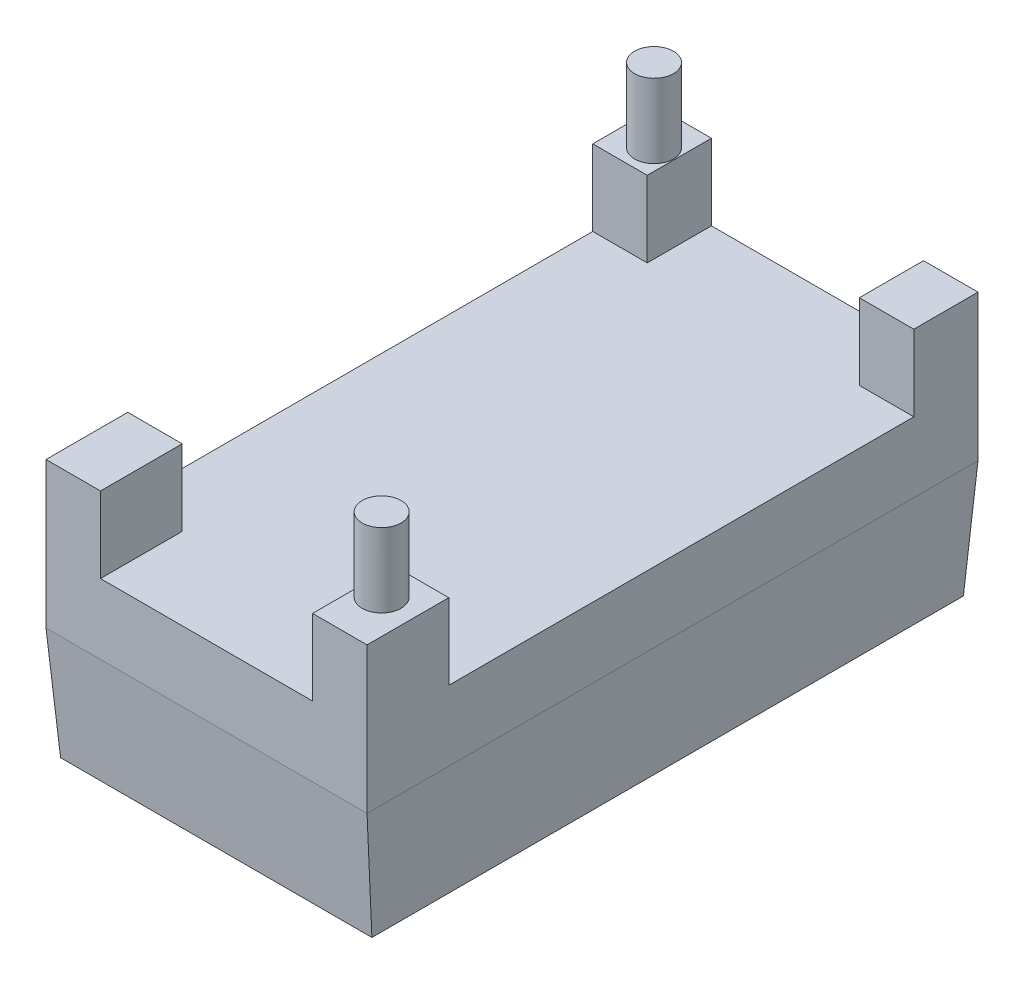
ISO-10303-21;
HEADER;
FILE_DESCRIPTION(('STEP AP214'),'2;1');
FILE_NAME('part.step','',(''),(''),'','','');
FILE_SCHEMA(('AUTOMOTIVE_DESIGN { 1 0 10303 214 1 1 1 1 }'));
ENDSEC;
DATA;
#1=APPLICATION_CONTEXT('core data for automotive mechanical design processes');
#2=APPLICATION_PROTOCOL_DEFINITION('international standard','automotive_design',2000,#1);
#3=PRODUCT_CONTEXT('',#1,'mechanical');
#4=PRODUCT('Part','Part','',(#3));
#5=PRODUCT_RELATED_PRODUCT_CATEGORY('part','',(#4));
#6=PRODUCT_DEFINITION_FORMATION('','',#4);
#7=PRODUCT_DEFINITION_CONTEXT('part definition',#1,'design');
#8=PRODUCT_DEFINITION('design','',#6,#7);
#9=PRODUCT_DEFINITION_SHAPE('','',#8);
#10=(LENGTH_UNIT() NAMED_UNIT(*) SI_UNIT(.MILLI.,.METRE.));
#11=(NAMED_UNIT(*) PLANE_ANGLE_UNIT() SI_UNIT($,.RADIAN.));
#12=(NAMED_UNIT(*) SI_UNIT($,.STERADIAN.) SOLID_ANGLE_UNIT());
#13=UNCERTAINTY_MEASURE_WITH_UNIT(LENGTH_MEASURE(1.E-05),#10,'distance_accuracy_value','');
#14=(GEOMETRIC_REPRESENTATION_CONTEXT(3) GLOBAL_UNCERTAINTY_ASSIGNED_CONTEXT((#13)) GLOBAL_UNIT_ASSIGNED_CONTEXT((#10,
#11,#12)) REPRESENTATION_CONTEXT('',''));
#15=CARTESIAN_POINT('',(0.,0.,0.));
#16=DIRECTION('',(0.,0.,1.));
#17=DIRECTION('',(1.,0.,0.));
#18=AXIS2_PLACEMENT_3D('',#15,#16,#17);
#19=CARTESIAN_POINT('',(8.25,-0.5,15.7));
#20=DIRECTION('',(0.,0.,-1.));
#21=DIRECTION('',(-1.,0.,0.));
#22=AXIS2_PLACEMENT_3D('',#19,#20,#21);
#23=PLANE('',#22);
#24=DIRECTION('',(-1.,0.,0.));
#25=VECTOR('',#24,1.);
#26=CARTESIAN_POINT('',(8.25,2.94999999999996,15.7));
#27=LINE('',#26,#25);
#28=CARTESIAN_POINT('',(8.25,2.94999999999996,15.7));
#29=VERTEX_POINT('',#28);
#30=CARTESIAN_POINT('',(0.,2.94999999999996,15.7));
#31=VERTEX_POINT('',#30);
#32=EDGE_CURVE('E217',#29,#31,#27,.T.);
#33=ORIENTED_EDGE('',*,*,#32,.F.);
#34=DIRECTION('',(0.,1.,0.));
#35=VECTOR('',#34,1.);
#36=CARTESIAN_POINT('',(8.25,-0.5,15.7));
#37=LINE('',#36,#35);
#38=CARTESIAN_POINT('',(8.25,6.7,15.7));
#39=VERTEX_POINT('',#38);
#40=EDGE_CURVE('E61',#29,#39,#37,.T.);
#41=ORIENTED_EDGE('',*,*,#40,.T.);
#42=DIRECTION('',(1.,0.,0.));
#43=VECTOR('',#42,1.);
#44=CARTESIAN_POINT('',(0.,6.7,15.7));
#45=LINE('',#44,#43);
#46=CARTESIAN_POINT('',(6.85,6.7,15.7));
#47=VERTEX_POINT('',#46);
#48=EDGE_CURVE('E57',#47,#39,#45,.T.);
#49=ORIENTED_EDGE('',*,*,#48,.F.);
#50=DIRECTION('',(0.,1.,0.));
#51=VECTOR('',#50,1.);
#52=CARTESIAN_POINT('',(6.85,6.7,15.7));
#53=LINE('',#52,#51);
#54=CARTESIAN_POINT('',(6.85,4.75,15.7));
#55=VERTEX_POINT('',#54);
#56=EDGE_CURVE('E302',#55,#47,#53,.T.);
#57=ORIENTED_EDGE('',*,*,#56,.F.);
#58=DIRECTION('',(-1.,0.,0.));
#59=VECTOR('',#58,1.);
#60=CARTESIAN_POINT('',(0.,4.75,15.7));
#61=LINE('',#60,#59);
#62=CARTESIAN_POINT('',(1.4,4.75,15.7));
#63=VERTEX_POINT('',#62);
#64=EDGE_CURVE('E906',#55,#63,#61,.T.);
#65=ORIENTED_EDGE('',*,*,#64,.T.);
#66=DIRECTION('',(0.,-1.,0.));
#67=VECTOR('',#66,1.);
#68=CARTESIAN_POINT('',(1.4,6.7,15.7));
#69=LINE('',#68,#67);
#70=CARTESIAN_POINT('',(1.4,6.7,15.7));
#71=VERTEX_POINT('',#70);
#72=EDGE_CURVE('E909',#71,#63,#69,.T.);
#73=ORIENTED_EDGE('',*,*,#72,.F.);
#74=DIRECTION('',(1.,0.,0.));
#75=VECTOR('',#74,1.);
#76=CARTESIAN_POINT('',(0.,6.7,15.7));
#77=LINE('',#76,#75);
#78=CARTESIAN_POINT('',(0.,6.7,15.7));
#79=VERTEX_POINT('',#78);
#80=EDGE_CURVE('E907',#79,#71,#77,.T.);
#81=ORIENTED_EDGE('',*,*,#80,.F.);
#82=DIRECTION('',(0.,1.,0.));
#83=VECTOR('',#82,1.);
#84=CARTESIAN_POINT('',(0.,-0.5,15.7));
#85=LINE('',#84,#83);
#86=EDGE_CURVE('E229',#31,#79,#85,.T.);
#87=ORIENTED_EDGE('',*,*,#86,.F.);
#88=EDGE_LOOP('',(#33,#41,#49,#57,#65,#73,#81,#87));
#89=FACE_BOUND('',#88,.T.);
#90=ADVANCED_FACE('F50',(#89),#23,.F.);
#91=CARTESIAN_POINT('',(8.25,4.75,0.));
#92=DIRECTION('',(-1.,0.,0.));
#93=DIRECTION('',(0.,0.,1.));
#94=AXIS2_PLACEMENT_3D('',#91,#92,#93);
#95=PLANE('',#94);
#96=ORIENTED_EDGE('',*,*,#40,.F.);
#97=DIRECTION('',(0.,0.,1.));
#98=VECTOR('',#97,1.);
#99=CARTESIAN_POINT('',(8.25,2.95,-0.8));
#100=LINE('',#99,#98);
#101=CARTESIAN_POINT('',(8.25,2.95,0.));
#102=VERTEX_POINT('',#101);
#103=EDGE_CURVE('E231',#102,#29,#100,.T.);
#104=ORIENTED_EDGE('',*,*,#103,.F.);
#105=DIRECTION('',(0.,-1.,0.));
#106=VECTOR('',#105,1.);
#107=CARTESIAN_POINT('',(8.25,4.75,0.));
#108=LINE('',#107,#106);
#109=CARTESIAN_POINT('',(8.25,6.7,0.));
#110=VERTEX_POINT('',#109);
#111=EDGE_CURVE('E243',#110,#102,#108,.T.);
#112=ORIENTED_EDGE('',*,*,#111,.F.);
#113=DIRECTION('',(0.,0.,-1.));
#114=VECTOR('',#113,1.);
#115=CARTESIAN_POINT('',(8.25,6.7,0.));
#116=LINE('',#115,#114);
#117=CARTESIAN_POINT('',(8.25,6.7,1.65));
#118=VERTEX_POINT('',#117);
#119=EDGE_CURVE('E248',#118,#110,#116,.T.);
#120=ORIENTED_EDGE('',*,*,#119,.F.);
#121=DIRECTION('',(0.,-1.,0.));
#122=VECTOR('',#121,1.);
#123=CARTESIAN_POINT('',(8.25,6.7,1.65));
#124=LINE('',#123,#122);
#125=CARTESIAN_POINT('',(8.25,4.75,1.65));
#126=VERTEX_POINT('',#125);
#127=EDGE_CURVE('E386',#118,#126,#124,.T.);
#128=ORIENTED_EDGE('',*,*,#127,.T.);
#129=DIRECTION('',(0.,0.,-1.));
#130=VECTOR('',#129,1.);
#131=CARTESIAN_POINT('',(8.25,4.75,0.));
#132=LINE('',#131,#130);
#133=CARTESIAN_POINT('',(8.25,4.75,13.6));
#134=VERTEX_POINT('',#133);
#135=EDGE_CURVE('E387',#134,#126,#132,.T.);
#136=ORIENTED_EDGE('',*,*,#135,.F.);
#137=DIRECTION('',(0.,-1.,0.));
#138=VECTOR('',#137,1.);
#139=CARTESIAN_POINT('',(8.25,6.7,13.6));
#140=LINE('',#139,#138);
#141=CARTESIAN_POINT('',(8.25,6.7,13.6));
#142=VERTEX_POINT('',#141);
#143=EDGE_CURVE('E382',#142,#134,#140,.T.);
#144=ORIENTED_EDGE('',*,*,#143,.F.);
#145=DIRECTION('',(0.,0.,-1.));
#146=VECTOR('',#145,1.);
#147=CARTESIAN_POINT('',(8.25,6.7,16.2));
#148=LINE('',#147,#146);
#149=EDGE_CURVE('E240',#39,#142,#148,.T.);
#150=ORIENTED_EDGE('',*,*,#149,.F.);
#151=EDGE_LOOP('',(#96,#104,#112,#120,#128,#136,#144,#150));
#152=FACE_BOUND('',#151,.T.);
#153=ADVANCED_FACE('F234',(#152),#95,.F.);
#154=CARTESIAN_POINT('',(1.775,-0.5,13.95));
#155=DIRECTION('',(1.,0.,0.));
#156=DIRECTION('',(0.,0.,-1.));
#157=AXIS2_PLACEMENT_3D('',#154,#155,#156);
#158=PLANE('',#157);
#159=DIRECTION('',(0.,0.,-1.));
#160=VECTOR('',#159,1.);
#161=CARTESIAN_POINT('',(1.775,1.25,13.95));
#162=LINE('',#161,#160);
#163=CARTESIAN_POINT('',(1.775,1.25,13.95));
#164=VERTEX_POINT('',#163);
#165=CARTESIAN_POINT('',(1.775,1.25,10.95));
#166=VERTEX_POINT('',#165);
#167=EDGE_CURVE('E75',#164,#166,#162,.T.);
#168=ORIENTED_EDGE('',*,*,#167,.T.);
#169=DIRECTION('',(0.,0.824728851845977,-0.565528355551529));
#170=VECTOR('',#169,1.);
#171=CARTESIAN_POINT('',(1.775,-0.5,12.15));
#172=LINE('',#171,#170);
#173=CARTESIAN_POINT('',(1.775,-0.5,12.15));
#174=VERTEX_POINT('',#173);
#175=EDGE_CURVE('E291',#174,#166,#172,.T.);
#176=ORIENTED_EDGE('',*,*,#175,.F.);
#177=DIRECTION('',(0.,0.697078393291808,0.71699491881443));
#178=VECTOR('',#177,1.);
#179=CARTESIAN_POINT('',(1.775,-0.5,12.15));
#180=LINE('',#179,#178);
#181=EDGE_CURVE('E292',#174,#164,#180,.T.);
#182=ORIENTED_EDGE('',*,*,#181,.T.);
#183=EDGE_LOOP('',(#168,#176,#182));
#184=FACE_BOUND('',#183,.T.);
#185=ADVANCED_FACE('F47',(#184),#158,.F.);
#186=CARTESIAN_POINT('',(6.475,-0.5,13.95));
#187=DIRECTION('',(-1.,0.,0.));
#188=DIRECTION('',(0.,0.,1.));
#189=AXIS2_PLACEMENT_3D('',#186,#187,#188);
#190=PLANE('',#189);
#191=DIRECTION('',(0.,0.697078393291808,0.71699491881443));
#192=VECTOR('',#191,1.);
#193=CARTESIAN_POINT('',(6.475,0.399642998809993,13.0753470844903));
#194=LINE('',#193,#192);
#195=CARTESIAN_POINT('',(6.475,-0.5,12.15));
#196=VERTEX_POINT('',#195);
#197=CARTESIAN_POINT('',(6.475,1.25,13.95));
#198=VERTEX_POINT('',#197);
#199=EDGE_CURVE('E289',#196,#198,#194,.T.);
#200=ORIENTED_EDGE('',*,*,#199,.F.);
#201=DIRECTION('',(0.,0.824728851845977,-0.565528355551529));
#202=VECTOR('',#201,1.);
#203=CARTESIAN_POINT('',(6.475,-1.33953359244864,12.7256801776791));
#204=LINE('',#203,#202);
#205=CARTESIAN_POINT('',(6.475,1.25,10.95));
#206=VERTEX_POINT('',#205);
#207=EDGE_CURVE('E287',#196,#206,#204,.T.);
#208=ORIENTED_EDGE('',*,*,#207,.T.);
#209=DIRECTION('',(0.,0.,1.));
#210=VECTOR('',#209,1.);
#211=CARTESIAN_POINT('',(6.475,1.25,13.95));
#212=LINE('',#211,#210);
#213=EDGE_CURVE('E281',#206,#198,#212,.T.);
#214=ORIENTED_EDGE('',*,*,#213,.T.);
#215=EDGE_LOOP('',(#200,#208,#214));
#216=FACE_BOUND('',#215,.T.);
#217=ADVANCED_FACE('F697',(#216),#190,.F.);
#218=CARTESIAN_POINT('',(0.,1.25,0.));
#219=DIRECTION('',(0.,-1.,0.));
#220=DIRECTION('',(0.,0.,-1.));
#221=AXIS2_PLACEMENT_3D('',#218,#219,#220);
#222=PLANE('',#221);
#223=CARTESIAN_POINT('',(4.125,1.25,7.95));
#224=DIRECTION('',(0.,-1.,0.));
#225=DIRECTION('',(0.,0.,-1.));
#226=AXIS2_PLACEMENT_3D('',#223,#224,#225);
#227=CIRCLE('',#226,1.6);
#228=CARTESIAN_POINT('',(4.125,1.25,6.35));
#229=VERTEX_POINT('',#228);
#230=EDGE_CURVE('E282',#229,#229,#227,.T.);
#231=ORIENTED_EDGE('',*,*,#230,.F.);
#232=EDGE_LOOP('',(#231));
#233=FACE_BOUND('',#232,.T.);
#234=ORIENTED_EDGE('',*,*,#213,.F.);
#235=DIRECTION('',(1.,0.,0.));
#236=VECTOR('',#235,1.);
#237=CARTESIAN_POINT('',(1.775,1.25,10.95));
#238=LINE('',#237,#236);
#239=EDGE_CURVE('E279',#166,#206,#238,.T.);
#240=ORIENTED_EDGE('',*,*,#239,.F.);
#241=ORIENTED_EDGE('',*,*,#167,.F.);
#242=DIRECTION('',(-1.,0.,0.));
#243=VECTOR('',#242,1.);
#244=CARTESIAN_POINT('',(1.775,1.25,13.95));
#245=LINE('',#244,#243);
#246=EDGE_CURVE('E274',#198,#164,#245,.T.);
#247=ORIENTED_EDGE('',*,*,#246,.F.);
#248=EDGE_LOOP('',(#234,#240,#241,#247));
#249=FACE_BOUND('',#248,.T.);
#250=DIRECTION('',(0.,0.,-1.));
#251=VECTOR('',#250,1.);
#252=CARTESIAN_POINT('',(1.575,1.25,14.45));
#253=LINE('',#252,#251);
#254=CARTESIAN_POINT('',(1.575,1.25,14.45));
#255=VERTEX_POINT('',#254);
#256=CARTESIAN_POINT('',(1.575,1.25,1.75));
#257=VERTEX_POINT('',#256);
#258=EDGE_CURVE('E272',#255,#257,#253,.T.);
#259=ORIENTED_EDGE('',*,*,#258,.T.);
#260=DIRECTION('',(1.,0.,0.));
#261=VECTOR('',#260,1.);
#262=CARTESIAN_POINT('',(1.575,1.25,1.75));
#263=LINE('',#262,#261);
#264=CARTESIAN_POINT('',(6.675,1.25,1.75));
#265=VERTEX_POINT('',#264);
#266=EDGE_CURVE('E271',#257,#265,#263,.T.);
#267=ORIENTED_EDGE('',*,*,#266,.T.);
#268=DIRECTION('',(0.,0.,1.));
#269=VECTOR('',#268,1.);
#270=CARTESIAN_POINT('',(6.675,1.25,14.45));
#271=LINE('',#270,#269);
#272=CARTESIAN_POINT('',(6.675,1.25,14.45));
#273=VERTEX_POINT('',#272);
#274=EDGE_CURVE('E267',#265,#273,#271,.T.);
#275=ORIENTED_EDGE('',*,*,#274,.T.);
#276=DIRECTION('',(-1.,0.,0.));
#277=VECTOR('',#276,1.);
#278=CARTESIAN_POINT('',(1.575,1.25,14.45));
#279=LINE('',#278,#277);
#280=EDGE_CURVE('E270',#273,#255,#279,.T.);
#281=ORIENTED_EDGE('',*,*,#280,.T.);
#282=EDGE_LOOP('',(#259,#267,#275,#281));
#283=FACE_BOUND('',#282,.T.);
#284=ADVANCED_FACE('F690',(#233,#249,#283),#222,.T.);
#285=CARTESIAN_POINT('',(0.,4.75,0.));
#286=DIRECTION('',(1.,0.,0.));
#287=DIRECTION('',(0.,0.,-1.));
#288=AXIS2_PLACEMENT_3D('',#285,#286,#287);
#289=PLANE('',#288);
#290=DIRECTION('',(0.,0.,1.));
#291=VECTOR('',#290,1.);
#292=CARTESIAN_POINT('',(0.,2.95,-0.8));
#293=LINE('',#292,#291);
#294=CARTESIAN_POINT('',(0.,2.95,0.));
#295=VERTEX_POINT('',#294);
#296=EDGE_CURVE('E262',#295,#31,#293,.T.);
#297=ORIENTED_EDGE('',*,*,#296,.T.);
#298=ORIENTED_EDGE('',*,*,#86,.T.);
#299=DIRECTION('',(0.,0.,1.));
#300=VECTOR('',#299,1.);
#301=CARTESIAN_POINT('',(0.,6.7,16.2));
#302=LINE('',#301,#300);
#303=CARTESIAN_POINT('',(0.,6.7,13.6));
#304=VERTEX_POINT('',#303);
#305=EDGE_CURVE('E261',#304,#79,#302,.T.);
#306=ORIENTED_EDGE('',*,*,#305,.F.);
#307=DIRECTION('',(0.,-1.,0.));
#308=VECTOR('',#307,1.);
#309=CARTESIAN_POINT('',(0.,6.7,13.6));
#310=LINE('',#309,#308);
#311=CARTESIAN_POINT('',(0.,4.75,13.6));
#312=VERTEX_POINT('',#311);
#313=EDGE_CURVE('E259',#304,#312,#310,.T.);
#314=ORIENTED_EDGE('',*,*,#313,.T.);
#315=DIRECTION('',(0.,0.,1.));
#316=VECTOR('',#315,1.);
#317=CARTESIAN_POINT('',(0.,4.75,0.));
#318=LINE('',#317,#316);
#319=CARTESIAN_POINT('',(0.,4.75,1.65));
#320=VERTEX_POINT('',#319);
#321=EDGE_CURVE('E258',#320,#312,#318,.T.);
#322=ORIENTED_EDGE('',*,*,#321,.F.);
#323=DIRECTION('',(0.,-1.,0.));
#324=VECTOR('',#323,1.);
#325=CARTESIAN_POINT('',(0.,6.7,1.65));
#326=LINE('',#325,#324);
#327=CARTESIAN_POINT('',(0.,6.7,1.65));
#328=VERTEX_POINT('',#327);
#329=EDGE_CURVE('E249',#328,#320,#326,.T.);
#330=ORIENTED_EDGE('',*,*,#329,.F.);
#331=DIRECTION('',(0.,0.,1.));
#332=VECTOR('',#331,1.);
#333=CARTESIAN_POINT('',(0.,6.7,0.));
#334=LINE('',#333,#332);
#335=CARTESIAN_POINT('',(0.,6.7,0.));
#336=VERTEX_POINT('',#335);
#337=EDGE_CURVE('E241',#336,#328,#334,.T.);
#338=ORIENTED_EDGE('',*,*,#337,.F.);
#339=DIRECTION('',(0.,-1.,0.));
#340=VECTOR('',#339,1.);
#341=CARTESIAN_POINT('',(0.,4.75,0.));
#342=LINE('',#341,#340);
#343=EDGE_CURVE('E264',#336,#295,#342,.T.);
#344=ORIENTED_EDGE('',*,*,#343,.T.);
#345=EDGE_LOOP('',(#297,#298,#306,#314,#322,#330,#338,#344));
#346=FACE_BOUND('',#345,.T.);
#347=ADVANCED_FACE('F303',(#346),#289,.F.);
#348=CARTESIAN_POINT('',(0.,4.75,0.));
#349=DIRECTION('',(0.,0.,1.));
#350=DIRECTION('',(1.,0.,0.));
#351=AXIS2_PLACEMENT_3D('',#348,#349,#350);
#352=PLANE('',#351);
#353=ORIENTED_EDGE('',*,*,#111,.T.);
#354=DIRECTION('',(-1.,0.,0.));
#355=VECTOR('',#354,1.);
#356=CARTESIAN_POINT('',(17.,2.95,0.));
#357=LINE('',#356,#355);
#358=EDGE_CURVE('E320',#102,#295,#357,.T.);
#359=ORIENTED_EDGE('',*,*,#358,.T.);
#360=ORIENTED_EDGE('',*,*,#343,.F.);
#361=DIRECTION('',(-1.,0.,0.));
#362=VECTOR('',#361,1.);
#363=CARTESIAN_POINT('',(0.,6.7,0.));
#364=LINE('',#363,#362);
#365=CARTESIAN_POINT('',(1.4,6.7,0.));
#366=VERTEX_POINT('',#365);
#367=EDGE_CURVE('E378',#366,#336,#364,.T.);
#368=ORIENTED_EDGE('',*,*,#367,.F.);
#369=DIRECTION('',(0.,-1.,0.));
#370=VECTOR('',#369,1.);
#371=CARTESIAN_POINT('',(1.4,6.7,0.));
#372=LINE('',#371,#370);
#373=CARTESIAN_POINT('',(1.4,4.75,0.));
#374=VERTEX_POINT('',#373);
#375=EDGE_CURVE('E376',#366,#374,#372,.T.);
#376=ORIENTED_EDGE('',*,*,#375,.T.);
#377=DIRECTION('',(-1.,0.,0.));
#378=VECTOR('',#377,1.);
#379=CARTESIAN_POINT('',(0.,4.75,0.));
#380=LINE('',#379,#378);
#381=CARTESIAN_POINT('',(6.85,4.75,0.));
#382=VERTEX_POINT('',#381);
#383=EDGE_CURVE('E373',#382,#374,#380,.T.);
#384=ORIENTED_EDGE('',*,*,#383,.F.);
#385=DIRECTION('',(0.,-1.,0.));
#386=VECTOR('',#385,1.);
#387=CARTESIAN_POINT('',(6.85,6.7,0.));
#388=LINE('',#387,#386);
#389=CARTESIAN_POINT('',(6.85,6.7,0.));
#390=VERTEX_POINT('',#389);
#391=EDGE_CURVE('E367',#390,#382,#388,.T.);
#392=ORIENTED_EDGE('',*,*,#391,.F.);
#393=DIRECTION('',(-1.,0.,0.));
#394=VECTOR('',#393,1.);
#395=CARTESIAN_POINT('',(8.25,6.7,0.));
#396=LINE('',#395,#394);
#397=EDGE_CURVE('E370',#110,#390,#396,.T.);
#398=ORIENTED_EDGE('',*,*,#397,.F.);
#399=EDGE_LOOP('',(#353,#359,#360,#368,#376,#384,#392,#398));
#400=FACE_BOUND('',#399,.T.);
#401=ADVANCED_FACE('F414',(#400),#352,.F.);
#402=CARTESIAN_POINT('',(0.,4.75,0.));
#403=DIRECTION('',(0.,1.,0.));
#404=DIRECTION('',(0.,0.,1.));
#405=AXIS2_PLACEMENT_3D('',#402,#403,#404);
#406=PLANE('',#405);
#407=ORIENTED_EDGE('',*,*,#64,.F.);
#408=DIRECTION('',(0.,0.,1.));
#409=VECTOR('',#408,1.);
#410=CARTESIAN_POINT('',(6.85,4.75,16.2));
#411=LINE('',#410,#409);
#412=CARTESIAN_POINT('',(6.85,4.75,13.6));
#413=VERTEX_POINT('',#412);
#414=EDGE_CURVE('E350',#413,#55,#411,.T.);
#415=ORIENTED_EDGE('',*,*,#414,.F.);
#416=DIRECTION('',(-1.,0.,0.));
#417=VECTOR('',#416,1.);
#418=CARTESIAN_POINT('',(8.25,4.75,13.6));
#419=LINE('',#418,#417);
#420=EDGE_CURVE('E341',#134,#413,#419,.T.);
#421=ORIENTED_EDGE('',*,*,#420,.F.);
#422=ORIENTED_EDGE('',*,*,#135,.T.);
#423=DIRECTION('',(1.,0.,0.));
#424=VECTOR('',#423,1.);
#425=CARTESIAN_POINT('',(8.25,4.75,1.65));
#426=LINE('',#425,#424);
#427=CARTESIAN_POINT('',(6.85,4.75,1.65));
#428=VERTEX_POINT('',#427);
#429=EDGE_CURVE('E365',#428,#126,#426,.T.);
#430=ORIENTED_EDGE('',*,*,#429,.F.);
#431=DIRECTION('',(0.,0.,1.));
#432=VECTOR('',#431,1.);
#433=CARTESIAN_POINT('',(6.85,4.75,0.));
#434=LINE('',#433,#432);
#435=EDGE_CURVE('E363',#382,#428,#434,.T.);
#436=ORIENTED_EDGE('',*,*,#435,.F.);
#437=ORIENTED_EDGE('',*,*,#383,.T.);
#438=DIRECTION('',(0.,0.,-1.));
#439=VECTOR('',#438,1.);
#440=CARTESIAN_POINT('',(1.4,4.75,0.));
#441=LINE('',#440,#439);
#442=CARTESIAN_POINT('',(1.4,4.75,1.65));
#443=VERTEX_POINT('',#442);
#444=EDGE_CURVE('E359',#443,#374,#441,.T.);
#445=ORIENTED_EDGE('',*,*,#444,.F.);
#446=DIRECTION('',(1.,0.,0.));
#447=VECTOR('',#446,1.);
#448=CARTESIAN_POINT('',(0.,4.75,1.65));
#449=LINE('',#448,#447);
#450=EDGE_CURVE('E353',#320,#443,#449,.T.);
#451=ORIENTED_EDGE('',*,*,#450,.F.);
#452=ORIENTED_EDGE('',*,*,#321,.T.);
#453=DIRECTION('',(-1.,0.,0.));
#454=VECTOR('',#453,1.);
#455=CARTESIAN_POINT('',(0.,4.75,13.6));
#456=LINE('',#455,#454);
#457=CARTESIAN_POINT('',(1.4,4.75,13.6));
#458=VERTEX_POINT('',#457);
#459=EDGE_CURVE('E355',#458,#312,#456,.T.);
#460=ORIENTED_EDGE('',*,*,#459,.F.);
#461=DIRECTION('',(0.,0.,-1.));
#462=VECTOR('',#461,1.);
#463=CARTESIAN_POINT('',(1.4,4.75,16.2));
#464=LINE('',#463,#462);
#465=EDGE_CURVE('E348',#63,#458,#464,.T.);
#466=ORIENTED_EDGE('',*,*,#465,.F.);
#467=EDGE_LOOP('',(#407,#415,#421,#422,#430,#436,#437,#445,#451,#452,#460,#466));
#468=FACE_BOUND('',#467,.T.);
#469=ADVANCED_FACE('F407',(#468),#406,.T.);
#470=CARTESIAN_POINT('',(0.,0.,0.));
#471=DIRECTION('',(0.,1.,0.));
#472=DIRECTION('',(0.,0.,1.));
#473=AXIS2_PLACEMENT_3D('',#470,#471,#472);
#474=PLANE('',#473);
#475=DIRECTION('',(1.,0.,0.));
#476=VECTOR('',#475,1.);
#477=CARTESIAN_POINT('',(1.575,0.,1.75));
#478=LINE('',#477,#476);
#479=CARTESIAN_POINT('',(1.575,0.,1.75));
#480=VERTEX_POINT('',#479);
#481=CARTESIAN_POINT('',(6.675,0.,1.75));
#482=VERTEX_POINT('',#481);
#483=EDGE_CURVE('E342',#480,#482,#478,.T.);
#484=ORIENTED_EDGE('',*,*,#483,.F.);
#485=DIRECTION('',(0.,0.,-1.));
#486=VECTOR('',#485,1.);
#487=CARTESIAN_POINT('',(1.575,0.,14.45));
#488=LINE('',#487,#486);
#489=CARTESIAN_POINT('',(1.575,0.,14.45));
#490=VERTEX_POINT('',#489);
#491=EDGE_CURVE('E339',#490,#480,#488,.T.);
#492=ORIENTED_EDGE('',*,*,#491,.F.);
#493=DIRECTION('',(-1.,0.,0.));
#494=VECTOR('',#493,1.);
#495=CARTESIAN_POINT('',(1.575,0.,14.45));
#496=LINE('',#495,#494);
#497=CARTESIAN_POINT('',(6.675,0.,14.45));
#498=VERTEX_POINT('',#497);
#499=EDGE_CURVE('E333',#498,#490,#496,.T.);
#500=ORIENTED_EDGE('',*,*,#499,.F.);
#501=DIRECTION('',(0.,0.,1.));
#502=VECTOR('',#501,1.);
#503=CARTESIAN_POINT('',(6.675,0.,14.45));
#504=LINE('',#503,#502);
#505=EDGE_CURVE('E335',#482,#498,#504,.T.);
#506=ORIENTED_EDGE('',*,*,#505,.F.);
#507=EDGE_LOOP('',(#484,#492,#500,#506));
#508=FACE_BOUND('',#507,.T.);
#509=DIRECTION('',(0.,0.,1.));
#510=VECTOR('',#509,1.);
#511=CARTESIAN_POINT('',(8.125,0.,0.));
#512=LINE('',#511,#510);
#513=CARTESIAN_POINT('',(8.125,0.,0.25));
#514=VERTEX_POINT('',#513);
#515=CARTESIAN_POINT('',(8.125,0.,15.45));
#516=VERTEX_POINT('',#515);
#517=EDGE_CURVE('E321',#514,#516,#512,.T.);
#518=ORIENTED_EDGE('',*,*,#517,.T.);
#519=DIRECTION('',(-1.,0.,0.));
#520=VECTOR('',#519,1.);
#521=CARTESIAN_POINT('',(8.25,0.,15.45));
#522=LINE('',#521,#520);
#523=CARTESIAN_POINT('',(0.125000000000002,0.,15.45));
#524=VERTEX_POINT('',#523);
#525=EDGE_CURVE('E219',#516,#524,#522,.T.);
#526=ORIENTED_EDGE('',*,*,#525,.T.);
#527=DIRECTION('',(0.,0.,-1.));
#528=VECTOR('',#527,1.);
#529=CARTESIAN_POINT('',(0.125000000000002,0.,0.));
#530=LINE('',#529,#528);
#531=CARTESIAN_POINT('',(0.125000000000002,0.,0.25));
#532=VERTEX_POINT('',#531);
#533=EDGE_CURVE('E329',#524,#532,#530,.T.);
#534=ORIENTED_EDGE('',*,*,#533,.T.);
#535=DIRECTION('',(-1.,0.,0.));
#536=VECTOR('',#535,1.);
#537=CARTESIAN_POINT('',(17.,0.,0.25));
#538=LINE('',#537,#536);
#539=EDGE_CURVE('E318',#514,#532,#538,.T.);
#540=ORIENTED_EDGE('',*,*,#539,.F.);
#541=EDGE_LOOP('',(#518,#526,#534,#540));
#542=FACE_BOUND('',#541,.T.);
#543=ADVANCED_FACE('F668',(#508,#542),#474,.F.);
#544=CARTESIAN_POINT('',(8.125,0.,-0.8));
#545=DIRECTION('',(-0.999103476537063,0.0423348930736044,0.));
#546=DIRECTION('',(-0.0423348930736044,-0.999103476537064,0.));
#547=AXIS2_PLACEMENT_3D('',#544,#545,#546);
#548=PLANE('',#547);
#549=ORIENTED_EDGE('',*,*,#103,.T.);
#550=DIRECTION('',(-0.0421839552960462,-0.995541344986689,-0.0843679105920936));
#551=VECTOR('',#550,1.);
#552=CARTESIAN_POINT('',(8.06716670225639,-1.36486582674926,15.3343334045128));
#553=LINE('',#552,#551);
#554=EDGE_CURVE('E216',#29,#516,#553,.T.);
#555=ORIENTED_EDGE('',*,*,#554,.T.);
#556=ORIENTED_EDGE('',*,*,#517,.F.);
#557=DIRECTION('',(0.0421839552960462,0.995541344986689,-0.0843679105920925));
#558=VECTOR('',#557,1.);
#559=CARTESIAN_POINT('',(8.12873692077728,0.0881913303437974,0.24252615844544));
#560=LINE('',#559,#558);
#561=EDGE_CURVE('E245',#514,#102,#560,.T.);
#562=ORIENTED_EDGE('',*,*,#561,.T.);
#563=EDGE_LOOP('',(#549,#555,#556,#562));
#564=FACE_BOUND('',#563,.T.);
#565=ADVANCED_FACE('F238',(#564),#548,.F.);
#566=CARTESIAN_POINT('',(0.125000000000002,0.,-0.8));
#567=DIRECTION('',(0.999103476537063,0.0423348930736044,0.));
#568=DIRECTION('',(-0.0423348930736045,0.999103476537064,0.));
#569=AXIS2_PLACEMENT_3D('',#566,#567,#568);
#570=PLANE('',#569);
#571=ORIENTED_EDGE('',*,*,#533,.F.);
#572=DIRECTION('',(-0.0421839552960462,0.995541344986689,0.0843679105920936));
#573=VECTOR('',#572,1.);
#574=CARTESIAN_POINT('',(0.182833297743615,-1.36486582674926,15.3343334045128));
#575=LINE('',#574,#573);
#576=EDGE_CURVE('E11',#524,#31,#575,.T.);
#577=ORIENTED_EDGE('',*,*,#576,.T.);
#578=ORIENTED_EDGE('',*,*,#296,.F.);
#579=DIRECTION('',(0.0421839552960462,-0.995541344986689,0.0843679105920925));
#580=VECTOR('',#579,1.);
#581=CARTESIAN_POINT('',(0.121263079222723,0.0881913303437975,0.242526158445441));
#582=LINE('',#581,#580);
#583=EDGE_CURVE('E311',#295,#532,#582,.T.);
#584=ORIENTED_EDGE('',*,*,#583,.T.);
#585=EDGE_LOOP('',(#571,#577,#578,#584));
#586=FACE_BOUND('',#585,.T.);
#587=ADVANCED_FACE('F315',(#586),#570,.F.);
#588=CARTESIAN_POINT('',(17.,0.,0.25));
#589=DIRECTION('',(0.,0.0844430766861809,0.996428304896931));
#590=DIRECTION('',(0.,-0.996428304896931,0.0844430766861809));
#591=AXIS2_PLACEMENT_3D('',#588,#589,#590);
#592=PLANE('',#591);
#593=ORIENTED_EDGE('',*,*,#539,.T.);
#594=ORIENTED_EDGE('',*,*,#583,.F.);
#595=ORIENTED_EDGE('',*,*,#358,.F.);
#596=ORIENTED_EDGE('',*,*,#561,.F.);
#597=EDGE_LOOP('',(#593,#594,#595,#596));
#598=FACE_BOUND('',#597,.T.);
#599=ADVANCED_FACE('F316',(#598),#592,.F.);
#600=CARTESIAN_POINT('',(0.,6.7,1.65));
#601=DIRECTION('',(0.,0.,-1.));
#602=DIRECTION('',(-1.,0.,0.));
#603=AXIS2_PLACEMENT_3D('',#600,#601,#602);
#604=PLANE('',#603);
#605=ORIENTED_EDGE('',*,*,#450,.T.);
#606=DIRECTION('',(0.,-1.,0.));
#607=VECTOR('',#606,1.);
#608=CARTESIAN_POINT('',(1.4,6.7,1.65));
#609=LINE('',#608,#607);
#610=CARTESIAN_POINT('',(1.4,6.7,1.65));
#611=VERTEX_POINT('',#610);
#612=EDGE_CURVE('E317',#611,#443,#609,.T.);
#613=ORIENTED_EDGE('',*,*,#612,.F.);
#614=DIRECTION('',(1.,0.,0.));
#615=VECTOR('',#614,1.);
#616=CARTESIAN_POINT('',(0.,6.7,1.65));
#617=LINE('',#616,#615);
#618=EDGE_CURVE('E322',#328,#611,#617,.T.);
#619=ORIENTED_EDGE('',*,*,#618,.F.);
#620=ORIENTED_EDGE('',*,*,#329,.T.);
#621=EDGE_LOOP('',(#605,#613,#619,#620));
#622=FACE_BOUND('',#621,.T.);
#623=ADVANCED_FACE('F424',(#622),#604,.F.);
#624=CARTESIAN_POINT('',(1.4,6.7,0.));
#625=DIRECTION('',(-1.,0.,0.));
#626=DIRECTION('',(0.,0.,1.));
#627=AXIS2_PLACEMENT_3D('',#624,#625,#626);
#628=PLANE('',#627);
#629=ORIENTED_EDGE('',*,*,#444,.T.);
#630=ORIENTED_EDGE('',*,*,#375,.F.);
#631=DIRECTION('',(0.,0.,-1.));
#632=VECTOR('',#631,1.);
#633=CARTESIAN_POINT('',(1.4,6.7,0.));
#634=LINE('',#633,#632);
#635=EDGE_CURVE('E419',#611,#366,#634,.T.);
#636=ORIENTED_EDGE('',*,*,#635,.F.);
#637=ORIENTED_EDGE('',*,*,#612,.T.);
#638=EDGE_LOOP('',(#629,#630,#636,#637));
#639=FACE_BOUND('',#638,.T.);
#640=ADVANCED_FACE('F417',(#639),#628,.F.);
#641=CARTESIAN_POINT('',(0.,6.7,0.));
#642=DIRECTION('',(0.,1.,0.));
#643=DIRECTION('',(0.,0.,1.));
#644=AXIS2_PLACEMENT_3D('',#641,#642,#643);
#645=PLANE('',#644);
#646=CARTESIAN_POINT('',(0.875,6.7,0.95));
#647=DIRECTION('',(0.,1.,0.));
#648=DIRECTION('',(0.,0.,1.));
#649=AXIS2_PLACEMENT_3D('',#646,#647,#648);
#650=CIRCLE('',#649,0.5);
#651=CARTESIAN_POINT('',(0.875,6.7,1.45));
#652=VERTEX_POINT('',#651);
#653=EDGE_CURVE('E437',#652,#652,#650,.T.);
#654=ORIENTED_EDGE('',*,*,#653,.F.);
#655=EDGE_LOOP('',(#654));
#656=FACE_BOUND('',#655,.T.);
#657=ORIENTED_EDGE('',*,*,#337,.T.);
#658=ORIENTED_EDGE('',*,*,#618,.T.);
#659=ORIENTED_EDGE('',*,*,#635,.T.);
#660=ORIENTED_EDGE('',*,*,#367,.T.);
#661=EDGE_LOOP('',(#657,#658,#659,#660));
#662=FACE_BOUND('',#661,.T.);
#663=ADVANCED_FACE('F450',(#656,#662),#645,.T.);
#664=CARTESIAN_POINT('',(1.4,6.7,16.2));
#665=DIRECTION('',(-1.,0.,0.));
#666=DIRECTION('',(0.,0.,1.));
#667=AXIS2_PLACEMENT_3D('',#664,#665,#666);
#668=PLANE('',#667);
#669=DIRECTION('',(0.,0.,-1.));
#670=VECTOR('',#669,1.);
#671=CARTESIAN_POINT('',(1.4,6.7,16.2));
#672=LINE('',#671,#670);
#673=CARTESIAN_POINT('',(1.4,6.7,13.6));
#674=VERTEX_POINT('',#673);
#675=EDGE_CURVE('E438',#71,#674,#672,.T.);
#676=ORIENTED_EDGE('',*,*,#675,.F.);
#677=ORIENTED_EDGE('',*,*,#72,.T.);
#678=ORIENTED_EDGE('',*,*,#465,.T.);
#679=DIRECTION('',(0.,-1.,0.));
#680=VECTOR('',#679,1.);
#681=CARTESIAN_POINT('',(1.4,6.7,13.6));
#682=LINE('',#681,#680);
#683=EDGE_CURVE('E432',#674,#458,#682,.T.);
#684=ORIENTED_EDGE('',*,*,#683,.F.);
#685=EDGE_LOOP('',(#676,#677,#678,#684));
#686=FACE_BOUND('',#685,.T.);
#687=ADVANCED_FACE('F446',(#686),#668,.F.);
#688=CARTESIAN_POINT('',(0.,6.7,13.6));
#689=DIRECTION('',(0.,0.,1.));
#690=DIRECTION('',(1.,0.,0.));
#691=AXIS2_PLACEMENT_3D('',#688,#689,#690);
#692=PLANE('',#691);
#693=ORIENTED_EDGE('',*,*,#459,.T.);
#694=ORIENTED_EDGE('',*,*,#313,.F.);
#695=DIRECTION('',(-1.,0.,0.));
#696=VECTOR('',#695,1.);
#697=CARTESIAN_POINT('',(0.,6.7,13.6));
#698=LINE('',#697,#696);
#699=EDGE_CURVE('E434',#674,#304,#698,.T.);
#700=ORIENTED_EDGE('',*,*,#699,.F.);
#701=ORIENTED_EDGE('',*,*,#683,.T.);
#702=EDGE_LOOP('',(#693,#694,#700,#701));
#703=FACE_BOUND('',#702,.T.);
#704=ADVANCED_FACE('F429',(#703),#692,.F.);
#705=CARTESIAN_POINT('',(0.,6.7,0.));
#706=DIRECTION('',(0.,-1.,0.));
#707=DIRECTION('',(0.,0.,-1.));
#708=AXIS2_PLACEMENT_3D('',#705,#706,#707);
#709=PLANE('',#708);
#710=ORIENTED_EDGE('',*,*,#305,.T.);
#711=ORIENTED_EDGE('',*,*,#80,.T.);
#712=ORIENTED_EDGE('',*,*,#675,.T.);
#713=ORIENTED_EDGE('',*,*,#699,.T.);
#714=EDGE_LOOP('',(#710,#711,#712,#713));
#715=FACE_BOUND('',#714,.T.);
#716=ADVANCED_FACE('F534',(#715),#709,.F.);
#717=CARTESIAN_POINT('',(8.25,6.7,13.6));
#718=DIRECTION('',(0.,0.,1.));
#719=DIRECTION('',(1.,0.,0.));
#720=AXIS2_PLACEMENT_3D('',#717,#718,#719);
#721=PLANE('',#720);
#722=ORIENTED_EDGE('',*,*,#420,.T.);
#723=DIRECTION('',(0.,-1.,0.));
#724=VECTOR('',#723,1.);
#725=CARTESIAN_POINT('',(6.85,6.7,13.6));
#726=LINE('',#725,#724);
#727=CARTESIAN_POINT('',(6.85,6.7,13.6));
#728=VERTEX_POINT('',#727);
#729=EDGE_CURVE('E904',#728,#413,#726,.T.);
#730=ORIENTED_EDGE('',*,*,#729,.F.);
#731=DIRECTION('',(-1.,0.,0.));
#732=VECTOR('',#731,1.);
#733=CARTESIAN_POINT('',(8.25,6.7,13.6));
#734=LINE('',#733,#732);
#735=EDGE_CURVE('E898',#142,#728,#734,.T.);
#736=ORIENTED_EDGE('',*,*,#735,.F.);
#737=ORIENTED_EDGE('',*,*,#143,.T.);
#738=EDGE_LOOP('',(#722,#730,#736,#737));
#739=FACE_BOUND('',#738,.T.);
#740=ADVANCED_FACE('F529',(#739),#721,.F.);
#741=CARTESIAN_POINT('',(6.85,6.7,16.2));
#742=DIRECTION('',(1.,0.,0.));
#743=DIRECTION('',(0.,0.,-1.));
#744=AXIS2_PLACEMENT_3D('',#741,#742,#743);
#745=PLANE('',#744);
#746=ORIENTED_EDGE('',*,*,#414,.T.);
#747=ORIENTED_EDGE('',*,*,#56,.T.);
#748=DIRECTION('',(0.,0.,1.));
#749=VECTOR('',#748,1.);
#750=CARTESIAN_POINT('',(6.85,6.7,16.2));
#751=LINE('',#750,#749);
#752=EDGE_CURVE('E900',#728,#47,#751,.T.);
#753=ORIENTED_EDGE('',*,*,#752,.F.);
#754=ORIENTED_EDGE('',*,*,#729,.T.);
#755=EDGE_LOOP('',(#746,#747,#753,#754));
#756=FACE_BOUND('',#755,.T.);
#757=ADVANCED_FACE('F528',(#756),#745,.F.);
#758=CARTESIAN_POINT('',(0.,6.7,0.));
#759=DIRECTION('',(0.,-1.,0.));
#760=DIRECTION('',(0.,0.,-1.));
#761=AXIS2_PLACEMENT_3D('',#758,#759,#760);
#762=PLANE('',#761);
#763=CARTESIAN_POINT('',(7.375,6.7,14.45));
#764=DIRECTION('',(0.,-1.,0.));
#765=DIRECTION('',(0.,0.,-1.));
#766=AXIS2_PLACEMENT_3D('',#763,#764,#765);
#767=CIRCLE('',#766,0.5);
#768=CARTESIAN_POINT('',(7.375,6.7,13.95));
#769=VERTEX_POINT('',#768);
#770=EDGE_CURVE('E891',#769,#769,#767,.F.);
#771=ORIENTED_EDGE('',*,*,#770,.F.);
#772=EDGE_LOOP('',(#771));
#773=FACE_BOUND('',#772,.T.);
#774=ORIENTED_EDGE('',*,*,#752,.T.);
#775=ORIENTED_EDGE('',*,*,#48,.T.);
#776=ORIENTED_EDGE('',*,*,#149,.T.);
#777=ORIENTED_EDGE('',*,*,#735,.T.);
#778=EDGE_LOOP('',(#774,#775,#776,#777));
#779=FACE_BOUND('',#778,.T.);
#780=ADVANCED_FACE('F521',(#773,#779),#762,.F.);
#781=CARTESIAN_POINT('',(6.85,6.7,0.));
#782=DIRECTION('',(1.,0.,0.));
#783=DIRECTION('',(0.,0.,-1.));
#784=AXIS2_PLACEMENT_3D('',#781,#782,#783);
#785=PLANE('',#784);
#786=ORIENTED_EDGE('',*,*,#435,.T.);
#787=DIRECTION('',(0.,-1.,0.));
#788=VECTOR('',#787,1.);
#789=CARTESIAN_POINT('',(6.85,6.7,1.65));
#790=LINE('',#789,#788);
#791=CARTESIAN_POINT('',(6.85,6.7,1.65));
#792=VERTEX_POINT('',#791);
#793=EDGE_CURVE('E405',#792,#428,#790,.T.);
#794=ORIENTED_EDGE('',*,*,#793,.F.);
#795=DIRECTION('',(0.,0.,1.));
#796=VECTOR('',#795,1.);
#797=CARTESIAN_POINT('',(6.85,6.7,0.));
#798=LINE('',#797,#796);
#799=EDGE_CURVE('E412',#390,#792,#798,.T.);
#800=ORIENTED_EDGE('',*,*,#799,.F.);
#801=ORIENTED_EDGE('',*,*,#391,.T.);
#802=EDGE_LOOP('',(#786,#794,#800,#801));
#803=FACE_BOUND('',#802,.T.);
#804=ADVANCED_FACE('F406',(#803),#785,.F.);
#805=CARTESIAN_POINT('',(8.25,6.7,1.65));
#806=DIRECTION('',(0.,0.,-1.));
#807=DIRECTION('',(-1.,0.,0.));
#808=AXIS2_PLACEMENT_3D('',#805,#806,#807);
#809=PLANE('',#808);
#810=ORIENTED_EDGE('',*,*,#429,.T.);
#811=ORIENTED_EDGE('',*,*,#127,.F.);
#812=DIRECTION('',(1.,0.,0.));
#813=VECTOR('',#812,1.);
#814=CARTESIAN_POINT('',(8.25,6.7,1.65));
#815=LINE('',#814,#813);
#816=EDGE_CURVE('E400',#792,#118,#815,.T.);
#817=ORIENTED_EDGE('',*,*,#816,.F.);
#818=ORIENTED_EDGE('',*,*,#793,.T.);
#819=EDGE_LOOP('',(#810,#811,#817,#818));
#820=FACE_BOUND('',#819,.T.);
#821=ADVANCED_FACE('F398',(#820),#809,.F.);
#822=CARTESIAN_POINT('',(0.,6.7,0.));
#823=DIRECTION('',(0.,1.,0.));
#824=DIRECTION('',(0.,0.,1.));
#825=AXIS2_PLACEMENT_3D('',#822,#823,#824);
#826=PLANE('',#825);
#827=ORIENTED_EDGE('',*,*,#397,.T.);
#828=ORIENTED_EDGE('',*,*,#799,.T.);
#829=ORIENTED_EDGE('',*,*,#816,.T.);
#830=ORIENTED_EDGE('',*,*,#119,.T.);
#831=EDGE_LOOP('',(#827,#828,#829,#830));
#832=FACE_BOUND('',#831,.T.);
#833=ADVANCED_FACE('F394',(#832),#826,.T.);
#834=CARTESIAN_POINT('',(7.375,8.6,14.45));
#835=DIRECTION('',(0.,-1.,0.));
#836=DIRECTION('',(0.,0.,-1.));
#837=AXIS2_PLACEMENT_3D('',#834,#835,#836);
#838=CYLINDRICAL_SURFACE('',#837,0.5);
#839=CARTESIAN_POINT('',(7.375,8.6,14.45));
#840=DIRECTION('',(0.,1.,0.));
#841=DIRECTION('',(0.,0.,1.));
#842=AXIS2_PLACEMENT_3D('',#839,#840,#841);
#843=CIRCLE('',#842,0.5);
#844=CARTESIAN_POINT('',(7.375,8.6,14.95));
#845=VERTEX_POINT('',#844);
#846=EDGE_CURVE('E889',#845,#845,#843,.T.);
#847=ORIENTED_EDGE('',*,*,#846,.F.);
#848=EDGE_LOOP('',(#847));
#849=FACE_BOUND('',#848,.T.);
#850=ORIENTED_EDGE('',*,*,#770,.T.);
#851=EDGE_LOOP('',(#850));
#852=FACE_BOUND('',#851,.T.);
#853=ADVANCED_FACE('F511',(#849,#852),#838,.T.);
#854=CARTESIAN_POINT('',(7.375,8.6,14.45));
#855=DIRECTION('',(0.,1.,0.));
#856=DIRECTION('',(0.,0.,1.));
#857=AXIS2_PLACEMENT_3D('',#854,#855,#856);
#858=PLANE('',#857);
#859=ORIENTED_EDGE('',*,*,#846,.T.);
#860=EDGE_LOOP('',(#859));
#861=FACE_BOUND('',#860,.T.);
#862=ADVANCED_FACE('F506',(#861),#858,.T.);
#863=CARTESIAN_POINT('',(0.875,8.6,0.95));
#864=DIRECTION('',(0.,-1.,0.));
#865=DIRECTION('',(0.,0.,-1.));
#866=AXIS2_PLACEMENT_3D('',#863,#864,#865);
#867=CYLINDRICAL_SURFACE('',#866,0.5);
#868=CARTESIAN_POINT('',(0.875,8.6,0.95));
#869=DIRECTION('',(0.,1.,0.));
#870=DIRECTION('',(0.,0.,1.));
#871=AXIS2_PLACEMENT_3D('',#868,#869,#870);
#872=CIRCLE('',#871,0.5);
#873=CARTESIAN_POINT('',(0.875,8.6,1.45));
#874=VERTEX_POINT('',#873);
#875=EDGE_CURVE('E867',#874,#874,#872,.T.);
#876=ORIENTED_EDGE('',*,*,#875,.F.);
#877=EDGE_LOOP('',(#876));
#878=FACE_BOUND('',#877,.T.);
#879=ORIENTED_EDGE('',*,*,#653,.T.);
#880=EDGE_LOOP('',(#879));
#881=FACE_BOUND('',#880,.T.);
#882=ADVANCED_FACE('F503',(#878,#881),#867,.T.);
#883=CARTESIAN_POINT('',(0.875,8.6,0.95));
#884=DIRECTION('',(0.,1.,0.));
#885=DIRECTION('',(0.,0.,1.));
#886=AXIS2_PLACEMENT_3D('',#883,#884,#885);
#887=PLANE('',#886);
#888=ORIENTED_EDGE('',*,*,#875,.T.);
#889=EDGE_LOOP('',(#888));
#890=FACE_BOUND('',#889,.T.);
#891=ADVANCED_FACE('F502',(#890),#887,.T.);
#892=CARTESIAN_POINT('',(1.575,1.25,14.45));
#893=DIRECTION('',(-1.,0.,0.));
#894=DIRECTION('',(0.,0.,1.));
#895=AXIS2_PLACEMENT_3D('',#892,#893,#894);
#896=PLANE('',#895);
#897=ORIENTED_EDGE('',*,*,#491,.T.);
#898=DIRECTION('',(0.,-1.,0.));
#899=VECTOR('',#898,1.);
#900=CARTESIAN_POINT('',(1.575,1.25,1.75));
#901=LINE('',#900,#899);
#902=EDGE_CURVE('E868',#257,#480,#901,.T.);
#903=ORIENTED_EDGE('',*,*,#902,.F.);
#904=ORIENTED_EDGE('',*,*,#258,.F.);
#905=DIRECTION('',(0.,-1.,0.));
#906=VECTOR('',#905,1.);
#907=CARTESIAN_POINT('',(1.575,1.25,14.45));
#908=LINE('',#907,#906);
#909=EDGE_CURVE('E869',#255,#490,#908,.T.);
#910=ORIENTED_EDGE('',*,*,#909,.T.);
#911=EDGE_LOOP('',(#897,#903,#904,#910));
#912=FACE_BOUND('',#911,.T.);
#913=ADVANCED_FACE('F500',(#912),#896,.F.);
#914=CARTESIAN_POINT('',(1.575,1.25,14.45));
#915=DIRECTION('',(0.,0.,1.));
#916=DIRECTION('',(1.,0.,0.));
#917=AXIS2_PLACEMENT_3D('',#914,#915,#916);
#918=PLANE('',#917);
#919=ORIENTED_EDGE('',*,*,#499,.T.);
#920=ORIENTED_EDGE('',*,*,#909,.F.);
#921=ORIENTED_EDGE('',*,*,#280,.F.);
#922=DIRECTION('',(0.,-1.,0.));
#923=VECTOR('',#922,1.);
#924=CARTESIAN_POINT('',(6.675,1.25,14.45));
#925=LINE('',#924,#923);
#926=EDGE_CURVE('E874',#273,#498,#925,.T.);
#927=ORIENTED_EDGE('',*,*,#926,.T.);
#928=EDGE_LOOP('',(#919,#920,#921,#927));
#929=FACE_BOUND('',#928,.T.);
#930=ADVANCED_FACE('F492',(#929),#918,.F.);
#931=CARTESIAN_POINT('',(6.675,1.25,14.45));
#932=DIRECTION('',(1.,0.,0.));
#933=DIRECTION('',(0.,0.,-1.));
#934=AXIS2_PLACEMENT_3D('',#931,#932,#933);
#935=PLANE('',#934);
#936=ORIENTED_EDGE('',*,*,#505,.T.);
#937=ORIENTED_EDGE('',*,*,#926,.F.);
#938=ORIENTED_EDGE('',*,*,#274,.F.);
#939=DIRECTION('',(0.,-1.,0.));
#940=VECTOR('',#939,1.);
#941=CARTESIAN_POINT('',(6.675,1.25,1.75));
#942=LINE('',#941,#940);
#943=EDGE_CURVE('E872',#265,#482,#942,.T.);
#944=ORIENTED_EDGE('',*,*,#943,.T.);
#945=EDGE_LOOP('',(#936,#937,#938,#944));
#946=FACE_BOUND('',#945,.T.);
#947=ADVANCED_FACE('F487',(#946),#935,.F.);
#948=CARTESIAN_POINT('',(1.575,1.25,1.75));
#949=DIRECTION('',(0.,0.,-1.));
#950=DIRECTION('',(-1.,0.,0.));
#951=AXIS2_PLACEMENT_3D('',#948,#949,#950);
#952=PLANE('',#951);
#953=ORIENTED_EDGE('',*,*,#483,.T.);
#954=ORIENTED_EDGE('',*,*,#943,.F.);
#955=ORIENTED_EDGE('',*,*,#266,.F.);
#956=ORIENTED_EDGE('',*,*,#902,.T.);
#957=EDGE_LOOP('',(#953,#954,#955,#956));
#958=FACE_BOUND('',#957,.T.);
#959=ADVANCED_FACE('F484',(#958),#952,.F.);
#960=CARTESIAN_POINT('',(6.525,-0.5,12.15));
#961=DIRECTION('',(0.,-0.71699491881443,0.697078393291808));
#962=DIRECTION('',(0.,-0.697078393291808,-0.71699491881443));
#963=AXIS2_PLACEMENT_3D('',#960,#961,#962);
#964=PLANE('',#963);
#965=ORIENTED_EDGE('',*,*,#199,.T.);
#966=ORIENTED_EDGE('',*,*,#246,.T.);
#967=ORIENTED_EDGE('',*,*,#181,.F.);
#968=DIRECTION('',(-1.,0.,0.));
#969=VECTOR('',#968,1.);
#970=CARTESIAN_POINT('',(0.,-0.5,12.15));
#971=LINE('',#970,#969);
#972=EDGE_CURVE('E876',#196,#174,#971,.T.);
#973=ORIENTED_EDGE('',*,*,#972,.F.);
#974=EDGE_LOOP('',(#965,#966,#967,#973));
#975=FACE_BOUND('',#974,.T.);
#976=ADVANCED_FACE('F481',(#975),#964,.T.);
#977=CARTESIAN_POINT('',(6.525,-0.5,12.15));
#978=DIRECTION('',(0.,0.565528355551529,0.824728851845977));
#979=DIRECTION('',(0.,-0.824728851845977,0.565528355551529));
#980=AXIS2_PLACEMENT_3D('',#977,#978,#979);
#981=PLANE('',#980);
#982=ORIENTED_EDGE('',*,*,#972,.T.);
#983=ORIENTED_EDGE('',*,*,#175,.T.);
#984=ORIENTED_EDGE('',*,*,#239,.T.);
#985=ORIENTED_EDGE('',*,*,#207,.F.);
#986=EDGE_LOOP('',(#982,#983,#984,#985));
#987=FACE_BOUND('',#986,.T.);
#988=ADVANCED_FACE('F480',(#987),#981,.F.);
#989=CARTESIAN_POINT('',(4.125,0.5,7.95));
#990=DIRECTION('',(0.,-1.,0.));
#991=DIRECTION('',(0.,0.,-1.));
#992=AXIS2_PLACEMENT_3D('',#989,#990,#991);
#993=PLANE('',#992);
#994=CARTESIAN_POINT('',(4.125,0.5,7.95));
#995=DIRECTION('',(0.,-1.,0.));
#996=DIRECTION('',(0.,0.,-1.));
#997=AXIS2_PLACEMENT_3D('',#994,#995,#996);
#998=CIRCLE('',#997,0.163859338365493);
#999=CARTESIAN_POINT('',(4.125,0.5,7.78614066163451));
#1000=VERTEX_POINT('',#999);
#1001=EDGE_CURVE('E882',#1000,#1000,#998,.T.);
#1002=ORIENTED_EDGE('',*,*,#1001,.T.);
#1003=EDGE_LOOP('',(#1002));
#1004=FACE_BOUND('',#1003,.T.);
#1005=ADVANCED_FACE('F471',(#1004),#993,.T.);
#1006=CARTESIAN_POINT('',(4.125,2.25,7.95));
#1007=DIRECTION('',(0.,1.,0.));
#1008=DIRECTION('',(0.,0.,1.));
#1009=AXIS2_PLACEMENT_3D('',#1006,#1007,#1008);
#1010=DEGENERATE_TOROIDAL_SURFACE('',#1009,0.163859338365493,1.75,.T.);
#1011=ORIENTED_EDGE('',*,*,#230,.T.);
#1012=EDGE_LOOP('',(#1011));
#1013=FACE_BOUND('',#1012,.T.);
#1014=ORIENTED_EDGE('',*,*,#1001,.F.);
#1015=EDGE_LOOP('',(#1014));
#1016=FACE_BOUND('',#1015,.T.);
#1017=ADVANCED_FACE('F468',(#1013,#1016),#1010,.T.);
#1018=CARTESIAN_POINT('',(8.25,2.94999999999996,15.7));
#1019=DIRECTION('',(0.,0.0844430766861819,-0.996428304896931));
#1020=DIRECTION('',(0.,0.996428304896931,0.084443076686182));
#1021=AXIS2_PLACEMENT_3D('',#1018,#1019,#1020);
#1022=PLANE('',#1021);
#1023=ORIENTED_EDGE('',*,*,#32,.T.);
#1024=ORIENTED_EDGE('',*,*,#576,.F.);
#1025=ORIENTED_EDGE('',*,*,#525,.F.);
#1026=ORIENTED_EDGE('',*,*,#554,.F.);
#1027=EDGE_LOOP('',(#1023,#1024,#1025,#1026));
#1028=FACE_BOUND('',#1027,.T.);
#1029=ADVANCED_FACE('F220',(#1028),#1022,.F.);
#1030=CLOSED_SHELL('',(#90,#153,#185,#217,#284,#347,#401,#469,#543,#565,#587,#599,#623,#640,
#663,#687,#704,#716,#740,#757,#780,#804,#821,#833,#853,#862,#882,#891,#913,#930,#947,#959,#976,
#988,#1005,#1017,#1029));
#1031=MANIFOLD_SOLID_BREP('B2',#1030);
#1032=ADVANCED_BREP_SHAPE_REPRESENTATION('',(#18,#1031),#14);
#1033=SHAPE_DEFINITION_REPRESENTATION(#9,#1032);
ENDSEC;
END-ISO-10303-21;
